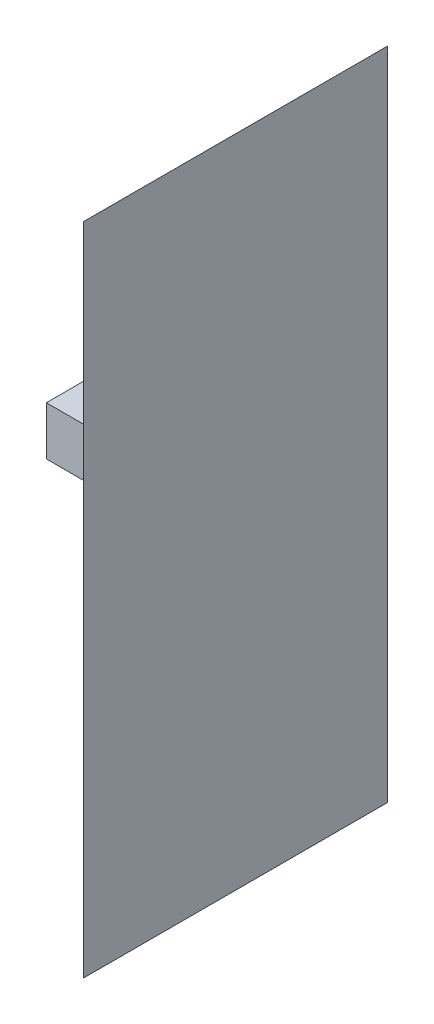
ISO-10303-21;
HEADER;
FILE_DESCRIPTION(('STEP AP214'),'2;1');
FILE_NAME('part.step','',(''),(''),'','','');
FILE_SCHEMA(('AUTOMOTIVE_DESIGN { 1 0 10303 214 1 1 1 1 }'));
ENDSEC;
DATA;
#1=APPLICATION_CONTEXT('core data for automotive mechanical design processes');
#2=APPLICATION_PROTOCOL_DEFINITION('international standard','automotive_design',2000,#1);
#3=PRODUCT_CONTEXT('',#1,'mechanical');
#4=PRODUCT('Part','Part','',(#3));
#5=PRODUCT_RELATED_PRODUCT_CATEGORY('part','',(#4));
#6=PRODUCT_DEFINITION_FORMATION('','',#4);
#7=PRODUCT_DEFINITION_CONTEXT('part definition',#1,'design');
#8=PRODUCT_DEFINITION('design','',#6,#7);
#9=PRODUCT_DEFINITION_SHAPE('','',#8);
#10=(LENGTH_UNIT() NAMED_UNIT(*) SI_UNIT(.MILLI.,.METRE.));
#11=(NAMED_UNIT(*) PLANE_ANGLE_UNIT() SI_UNIT($,.RADIAN.));
#12=(NAMED_UNIT(*) SI_UNIT($,.STERADIAN.) SOLID_ANGLE_UNIT());
#13=UNCERTAINTY_MEASURE_WITH_UNIT(LENGTH_MEASURE(1.E-05),#10,'distance_accuracy_value','');
#14=(GEOMETRIC_REPRESENTATION_CONTEXT(3) GLOBAL_UNCERTAINTY_ASSIGNED_CONTEXT((#13)) GLOBAL_UNIT_ASSIGNED_CONTEXT((#10,
#11,#12)) REPRESENTATION_CONTEXT('',''));
#15=CARTESIAN_POINT('',(0.,0.,0.));
#16=DIRECTION('',(0.,0.,1.));
#17=DIRECTION('',(1.,0.,0.));
#18=AXIS2_PLACEMENT_3D('',#15,#16,#17);
#19=CARTESIAN_POINT('',(47.7266,0.,0.));
#20=DIRECTION('',(1.,0.,0.));
#21=DIRECTION('',(0.,0.,-1.));
#22=AXIS2_PLACEMENT_3D('',#19,#20,#21);
#23=PLANE('',#22);
#24=DIRECTION('',(0.,-1.,0.));
#25=VECTOR('',#24,1.);
#26=CARTESIAN_POINT('',(47.7266,-94.7940905122506,43.9940905122497));
#27=LINE('',#26,#25);
#28=CARTESIAN_POINT('',(47.7266,94.7940905122506,43.9940905122497));
#29=VERTEX_POINT('',#28);
#30=CARTESIAN_POINT('',(47.7266,-94.7940905122506,43.9940905122497));
#31=VERTEX_POINT('',#30);
#32=EDGE_CURVE('E125',#29,#31,#27,.T.);
#33=ORIENTED_EDGE('',*,*,#32,.T.);
#34=DIRECTION('',(0.,0.,-1.));
#35=VECTOR('',#34,1.);
#36=CARTESIAN_POINT('',(47.7266,-94.7940905122506,-43.9940905122497));
#37=LINE('',#36,#35);
#38=CARTESIAN_POINT('',(47.7266,-94.7940905122506,-43.9940905122497));
#39=VERTEX_POINT('',#38);
#40=EDGE_CURVE('E109',#31,#39,#37,.T.);
#41=ORIENTED_EDGE('',*,*,#40,.T.);
#42=DIRECTION('',(0.,1.,0.));
#43=VECTOR('',#42,1.);
#44=CARTESIAN_POINT('',(47.7266,-94.7940905122506,-43.9940905122497));
#45=LINE('',#44,#43);
#46=CARTESIAN_POINT('',(47.7266,94.7940905122506,-43.9940905122497));
#47=VERTEX_POINT('',#46);
#48=EDGE_CURVE('E103',#39,#47,#45,.T.);
#49=ORIENTED_EDGE('',*,*,#48,.T.);
#50=DIRECTION('',(0.,0.,1.));
#51=VECTOR('',#50,1.);
#52=CARTESIAN_POINT('',(47.7266,94.7940905122506,-43.9940905122497));
#53=LINE('',#52,#51);
#54=EDGE_CURVE('E107',#47,#29,#53,.T.);
#55=ORIENTED_EDGE('',*,*,#54,.T.);
#56=EDGE_LOOP('',(#33,#41,#49,#55));
#57=FACE_BOUND('',#56,.T.);
#58=ADVANCED_FACE('F67',(#57),#23,.T.);
#59=CARTESIAN_POINT('',(16.74495,0.,-9.6677013900668));
#60=DIRECTION('',(0.86602540378444,0.,-0.499999999999998));
#61=DIRECTION('',(-0.499999999999998,0.,-0.86602540378444));
#62=AXIS2_PLACEMENT_3D('',#59,#60,#61);
#63=PLANE('',#62);
#64=DIRECTION('',(-0.236173745241571,-0.88141241665538,-0.409064926172231));
#65=VECTOR('',#64,1.);
#66=CARTESIAN_POINT('',(47.7266,94.7940905122506,43.9940905122497));
#67=LINE('',#66,#65);
#68=CARTESIAN_POINT('',(22.3266,0.,0.));
#69=VERTEX_POINT('',#68);
#70=EDGE_CURVE('E123',#29,#69,#67,.T.);
#71=ORIENTED_EDGE('',*,*,#70,.T.);
#72=DIRECTION('',(-0.236173745241571,0.88141241665538,-0.409064926172231));
#73=VECTOR('',#72,1.);
#74=CARTESIAN_POINT('',(47.7266,-94.7940905122506,43.9940905122497));
#75=LINE('',#74,#73);
#76=EDGE_CURVE('E88',#31,#69,#75,.T.);
#77=ORIENTED_EDGE('',*,*,#76,.F.);
#78=ORIENTED_EDGE('',*,*,#32,.F.);
#79=EDGE_LOOP('',(#71,#77,#78));
#80=FACE_BOUND('',#79,.T.);
#81=ADVANCED_FACE('F168',(#80),#63,.F.);
#82=CARTESIAN_POINT('',(20.8310013900669,5.58164999999995,0.));
#83=DIRECTION('',(-0.965925826289069,-0.258819045102518,0.));
#84=DIRECTION('',(0.258819045102518,-0.965925826289069,0.));
#85=AXIS2_PLACEMENT_3D('',#82,#83,#84);
#86=PLANE('',#85);
#87=ORIENTED_EDGE('',*,*,#76,.T.);
#88=DIRECTION('',(-0.236173745241571,0.88141241665538,0.409064926172231));
#89=VECTOR('',#88,1.);
#90=CARTESIAN_POINT('',(47.7266,-94.7940905122506,-43.9940905122497));
#91=LINE('',#90,#89);
#92=EDGE_CURVE('E13',#39,#69,#91,.T.);
#93=ORIENTED_EDGE('',*,*,#92,.F.);
#94=ORIENTED_EDGE('',*,*,#40,.F.);
#95=EDGE_LOOP('',(#87,#93,#94));
#96=FACE_BOUND('',#95,.T.);
#97=ADVANCED_FACE('F182',(#96),#86,.T.);
#98=CARTESIAN_POINT('',(20.8310013900669,-5.58164999999995,0.));
#99=DIRECTION('',(-0.965925826289069,0.258819045102518,0.));
#100=DIRECTION('',(-0.258819045102518,-0.965925826289069,0.));
#101=AXIS2_PLACEMENT_3D('',#98,#99,#100);
#102=PLANE('',#101);
#103=DIRECTION('',(-0.236173745241571,-0.88141241665538,0.409064926172231));
#104=VECTOR('',#103,1.);
#105=CARTESIAN_POINT('',(47.7266,94.7940905122506,-43.9940905122497));
#106=LINE('',#105,#104);
#107=EDGE_CURVE('E80',#47,#69,#106,.T.);
#108=ORIENTED_EDGE('',*,*,#107,.T.);
#109=ORIENTED_EDGE('',*,*,#70,.F.);
#110=ORIENTED_EDGE('',*,*,#54,.F.);
#111=EDGE_LOOP('',(#108,#109,#110));
#112=FACE_BOUND('',#111,.T.);
#113=ADVANCED_FACE('F122',(#112),#102,.T.);
#114=CARTESIAN_POINT('',(16.74495,0.,9.66770139006679));
#115=DIRECTION('',(0.86602540378444,0.,0.499999999999998));
#116=DIRECTION('',(0.499999999999998,0.,-0.86602540378444));
#117=AXIS2_PLACEMENT_3D('',#114,#115,#116);
#118=PLANE('',#117);
#119=ORIENTED_EDGE('',*,*,#92,.T.);
#120=ORIENTED_EDGE('',*,*,#107,.F.);
#121=ORIENTED_EDGE('',*,*,#48,.F.);
#122=EDGE_LOOP('',(#119,#120,#121));
#123=FACE_BOUND('',#122,.T.);
#124=ADVANCED_FACE('F69',(#123),#118,.F.);
#125=CLOSED_SHELL('',(#58,#81,#97,#113,#124));
#126=MANIFOLD_SOLID_BREP('B2',#125);
#127=CARTESIAN_POINT('',(0.,0.,0.));
#128=DIRECTION('',(1.,0.,0.));
#129=DIRECTION('',(0.,0.,-1.));
#130=AXIS2_PLACEMENT_3D('',#127,#128,#129);
#131=PLANE('',#130);
#132=DIRECTION('',(0.,-1.,0.));
#133=VECTOR('',#132,1.);
#134=CARTESIAN_POINT('',(0.,-7.0485,-4.5085));
#135=LINE('',#134,#133);
#136=CARTESIAN_POINT('',(0.,3.2893,-4.5085));
#137=VERTEX_POINT('',#136);
#138=CARTESIAN_POINT('',(0.,-7.0485,-4.5085));
#139=VERTEX_POINT('',#138);
#140=EDGE_CURVE('E279',#137,#139,#135,.T.);
#141=ORIENTED_EDGE('',*,*,#140,.F.);
#142=DIRECTION('',(0.,0.,-1.));
#143=VECTOR('',#142,1.);
#144=CARTESIAN_POINT('',(0.,3.2893,-1.0795));
#145=LINE('',#144,#143);
#146=CARTESIAN_POINT('',(0.,3.2893,-1.0795));
#147=VERTEX_POINT('',#146);
#148=EDGE_CURVE('E524',#147,#137,#145,.T.);
#149=ORIENTED_EDGE('',*,*,#148,.F.);
#150=DIRECTION('',(0.,1.,0.));
#151=VECTOR('',#150,1.);
#152=CARTESIAN_POINT('',(0.,-7.0485,-1.0795));
#153=LINE('',#152,#151);
#154=CARTESIAN_POINT('',(0.,-7.0485,-1.0795));
#155=VERTEX_POINT('',#154);
#156=EDGE_CURVE('E526',#155,#147,#153,.T.);
#157=ORIENTED_EDGE('',*,*,#156,.F.);
#158=DIRECTION('',(0.,0.,-1.));
#159=VECTOR('',#158,1.);
#160=CARTESIAN_POINT('',(0.,-7.0485,-7.0485));
#161=LINE('',#160,#159);
#162=CARTESIAN_POINT('',(0.,-7.0485,7.0485));
#163=VERTEX_POINT('',#162);
#164=EDGE_CURVE('E351',#163,#155,#161,.T.);
#165=ORIENTED_EDGE('',*,*,#164,.F.);
#166=DIRECTION('',(0.,-1.,0.));
#167=VECTOR('',#166,1.);
#168=CARTESIAN_POINT('',(0.,7.0485,7.0485));
#169=LINE('',#168,#167);
#170=CARTESIAN_POINT('',(0.,7.0485,7.0485));
#171=VERTEX_POINT('',#170);
#172=EDGE_CURVE('E370',#171,#163,#169,.T.);
#173=ORIENTED_EDGE('',*,*,#172,.F.);
#174=DIRECTION('',(0.,0.,1.));
#175=VECTOR('',#174,1.);
#176=CARTESIAN_POINT('',(0.,7.0485,-7.0485));
#177=LINE('',#176,#175);
#178=CARTESIAN_POINT('',(0.,7.0485,-7.0485));
#179=VERTEX_POINT('',#178);
#180=EDGE_CURVE('E380',#179,#171,#177,.T.);
#181=ORIENTED_EDGE('',*,*,#180,.F.);
#182=DIRECTION('',(0.,1.,0.));
#183=VECTOR('',#182,1.);
#184=CARTESIAN_POINT('',(0.,7.0485,-7.0485));
#185=LINE('',#184,#183);
#186=CARTESIAN_POINT('',(0.,-7.0485,-7.0485));
#187=VERTEX_POINT('',#186);
#188=EDGE_CURVE('E378',#187,#179,#185,.T.);
#189=ORIENTED_EDGE('',*,*,#188,.F.);
#190=EDGE_CURVE('E284',#139,#187,#161,.T.);
#191=ORIENTED_EDGE('',*,*,#190,.F.);
#192=EDGE_LOOP('',(#141,#149,#157,#165,#173,#181,#189,#191));
#193=FACE_BOUND('',#192,.T.);
#194=ADVANCED_FACE('F263',(#193),#131,.F.);
#195=CARTESIAN_POINT('',(12.446,-7.0485,-7.0485));
#196=DIRECTION('',(0.,1.,0.));
#197=DIRECTION('',(0.,0.,1.));
#198=AXIS2_PLACEMENT_3D('',#195,#196,#197);
#199=PLANE('',#198);
#200=CARTESIAN_POINT('',(8.255,-7.0485,0.));
#201=DIRECTION('',(0.,1.,0.));
#202=DIRECTION('',(0.,0.,1.));
#203=AXIS2_PLACEMENT_3D('',#200,#201,#202);
#204=CIRCLE('',#203,1.);
#205=CARTESIAN_POINT('',(8.255,-7.0485,1.));
#206=VERTEX_POINT('',#205);
#207=EDGE_CURVE('E355',#206,#206,#204,.T.);
#208=ORIENTED_EDGE('',*,*,#207,.T.);
#209=EDGE_LOOP('',(#208));
#210=FACE_BOUND('',#209,.T.);
#211=ORIENTED_EDGE('',*,*,#164,.T.);
#212=DIRECTION('',(1.,0.,0.));
#213=VECTOR('',#212,1.);
#214=CARTESIAN_POINT('',(-3.429,-7.0485,-1.0795));
#215=LINE('',#214,#213);
#216=CARTESIAN_POINT('',(-3.429,-7.0485,-1.0795));
#217=VERTEX_POINT('',#216);
#218=EDGE_CURVE('E332',#217,#155,#215,.T.);
#219=ORIENTED_EDGE('',*,*,#218,.F.);
#220=DIRECTION('',(0.,0.,1.));
#221=VECTOR('',#220,1.);
#222=CARTESIAN_POINT('',(-3.429,-7.0485,-1.0795));
#223=LINE('',#222,#221);
#224=CARTESIAN_POINT('',(-3.429,-7.0485,-4.5085));
#225=VERTEX_POINT('',#224);
#226=EDGE_CURVE('E338',#225,#217,#223,.T.);
#227=ORIENTED_EDGE('',*,*,#226,.F.);
#228=DIRECTION('',(1.,0.,0.));
#229=VECTOR('',#228,1.);
#230=CARTESIAN_POINT('',(-3.429,-7.0485,-4.5085));
#231=LINE('',#230,#229);
#232=EDGE_CURVE('E397',#225,#139,#231,.T.);
#233=ORIENTED_EDGE('',*,*,#232,.T.);
#234=ORIENTED_EDGE('',*,*,#190,.T.);
#235=DIRECTION('',(-1.,0.,0.));
#236=VECTOR('',#235,1.);
#237=CARTESIAN_POINT('',(12.446,-7.0485,-7.0485));
#238=LINE('',#237,#236);
#239=CARTESIAN_POINT('',(12.446,-7.0485,-7.0485));
#240=VERTEX_POINT('',#239);
#241=EDGE_CURVE('E267',#240,#187,#238,.T.);
#242=ORIENTED_EDGE('',*,*,#241,.F.);
#243=DIRECTION('',(0.,0.,-1.));
#244=VECTOR('',#243,1.);
#245=CARTESIAN_POINT('',(12.446,-7.0485,-7.0485));
#246=LINE('',#245,#244);
#247=CARTESIAN_POINT('',(12.446,-7.0485,7.0485));
#248=VERTEX_POINT('',#247);
#249=EDGE_CURVE('E366',#248,#240,#246,.T.);
#250=ORIENTED_EDGE('',*,*,#249,.F.);
#251=DIRECTION('',(-1.,0.,0.));
#252=VECTOR('',#251,1.);
#253=CARTESIAN_POINT('',(12.446,-7.0485,7.0485));
#254=LINE('',#253,#252);
#255=EDGE_CURVE('E376',#248,#163,#254,.T.);
#256=ORIENTED_EDGE('',*,*,#255,.T.);
#257=EDGE_LOOP('',(#211,#219,#227,#233,#234,#242,#250,#256));
#258=FACE_BOUND('',#257,.T.);
#259=ADVANCED_FACE('F265',(#210,#258),#199,.F.);
#260=CARTESIAN_POINT('',(12.446,7.0485,-7.0485));
#261=DIRECTION('',(0.,0.,1.));
#262=DIRECTION('',(0.,-1.,0.));
#263=AXIS2_PLACEMENT_3D('',#260,#261,#262);
#264=PLANE('',#263);
#265=ORIENTED_EDGE('',*,*,#188,.T.);
#266=DIRECTION('',(-1.,0.,0.));
#267=VECTOR('',#266,1.);
#268=CARTESIAN_POINT('',(12.446,7.0485,-7.0485));
#269=LINE('',#268,#267);
#270=CARTESIAN_POINT('',(12.446,7.0485,-7.0485));
#271=VERTEX_POINT('',#270);
#272=EDGE_CURVE('E386',#271,#179,#269,.T.);
#273=ORIENTED_EDGE('',*,*,#272,.F.);
#274=DIRECTION('',(0.,1.,0.));
#275=VECTOR('',#274,1.);
#276=CARTESIAN_POINT('',(12.446,7.0485,-7.0485));
#277=LINE('',#276,#275);
#278=EDGE_CURVE('E369',#240,#271,#277,.T.);
#279=ORIENTED_EDGE('',*,*,#278,.F.);
#280=ORIENTED_EDGE('',*,*,#241,.T.);
#281=EDGE_LOOP('',(#265,#273,#279,#280));
#282=FACE_BOUND('',#281,.T.);
#283=ADVANCED_FACE('F395',(#282),#264,.F.);
#284=CARTESIAN_POINT('',(12.446,7.0485,-7.0485));
#285=DIRECTION('',(0.,-1.,0.));
#286=DIRECTION('',(0.,0.,-1.));
#287=AXIS2_PLACEMENT_3D('',#284,#285,#286);
#288=PLANE('',#287);
#289=CARTESIAN_POINT('',(8.255,7.0485,0.));
#290=DIRECTION('',(0.,1.,0.));
#291=DIRECTION('',(0.,0.,1.));
#292=AXIS2_PLACEMENT_3D('',#289,#290,#291);
#293=CIRCLE('',#292,1.);
#294=CARTESIAN_POINT('',(8.255,7.0485,1.));
#295=VERTEX_POINT('',#294);
#296=EDGE_CURVE('E352',#295,#295,#293,.T.);
#297=ORIENTED_EDGE('',*,*,#296,.F.);
#298=EDGE_LOOP('',(#297));
#299=FACE_BOUND('',#298,.T.);
#300=ORIENTED_EDGE('',*,*,#180,.T.);
#301=DIRECTION('',(-1.,0.,0.));
#302=VECTOR('',#301,1.);
#303=CARTESIAN_POINT('',(12.446,7.0485,7.0485));
#304=LINE('',#303,#302);
#305=CARTESIAN_POINT('',(12.446,7.0485,7.0485));
#306=VERTEX_POINT('',#305);
#307=EDGE_CURVE('E384',#306,#171,#304,.T.);
#308=ORIENTED_EDGE('',*,*,#307,.F.);
#309=DIRECTION('',(0.,0.,1.));
#310=VECTOR('',#309,1.);
#311=CARTESIAN_POINT('',(12.446,7.0485,-7.0485));
#312=LINE('',#311,#310);
#313=EDGE_CURVE('E372',#271,#306,#312,.T.);
#314=ORIENTED_EDGE('',*,*,#313,.F.);
#315=ORIENTED_EDGE('',*,*,#272,.T.);
#316=EDGE_LOOP('',(#300,#308,#314,#315));
#317=FACE_BOUND('',#316,.T.);
#318=ADVANCED_FACE('F400',(#299,#317),#288,.F.);
#319=CARTESIAN_POINT('',(12.446,7.0485,7.0485));
#320=DIRECTION('',(0.,0.,-1.));
#321=DIRECTION('',(0.,1.,0.));
#322=AXIS2_PLACEMENT_3D('',#319,#320,#321);
#323=PLANE('',#322);
#324=ORIENTED_EDGE('',*,*,#172,.T.);
#325=ORIENTED_EDGE('',*,*,#255,.F.);
#326=DIRECTION('',(0.,-1.,0.));
#327=VECTOR('',#326,1.);
#328=CARTESIAN_POINT('',(12.446,7.0485,7.0485));
#329=LINE('',#328,#327);
#330=EDGE_CURVE('E374',#306,#248,#329,.T.);
#331=ORIENTED_EDGE('',*,*,#330,.F.);
#332=ORIENTED_EDGE('',*,*,#307,.T.);
#333=EDGE_LOOP('',(#324,#325,#331,#332));
#334=FACE_BOUND('',#333,.T.);
#335=ADVANCED_FACE('F403',(#334),#323,.F.);
#336=CARTESIAN_POINT('',(12.446,0.,0.));
#337=DIRECTION('',(1.,0.,0.));
#338=DIRECTION('',(0.,0.,-1.));
#339=AXIS2_PLACEMENT_3D('',#336,#337,#338);
#340=PLANE('',#339);
#341=CARTESIAN_POINT('',(12.446,0.,0.));
#342=DIRECTION('',(1.,0.,0.));
#343=DIRECTION('',(0.,0.,-1.));
#344=AXIS2_PLACEMENT_3D('',#341,#342,#343);
#345=CIRCLE('',#344,5.08);
#346=CARTESIAN_POINT('',(12.446,0.,-5.08));
#347=VERTEX_POINT('',#346);
#348=EDGE_CURVE('E65',#347,#347,#345,.T.);
#349=ORIENTED_EDGE('',*,*,#348,.F.);
#350=EDGE_LOOP('',(#349));
#351=FACE_BOUND('',#350,.T.);
#352=ORIENTED_EDGE('',*,*,#249,.T.);
#353=ORIENTED_EDGE('',*,*,#278,.T.);
#354=ORIENTED_EDGE('',*,*,#313,.T.);
#355=ORIENTED_EDGE('',*,*,#330,.T.);
#356=EDGE_LOOP('',(#352,#353,#354,#355));
#357=FACE_BOUND('',#356,.T.);
#358=ADVANCED_FACE('F406',(#351,#357),#340,.T.);
#359=CARTESIAN_POINT('',(22.3266,0.,0.));
#360=DIRECTION('',(-1.,0.,0.));
#361=DIRECTION('',(0.,0.,1.));
#362=AXIS2_PLACEMENT_3D('',#359,#360,#361);
#363=CYLINDRICAL_SURFACE('',#362,5.08);
#364=CARTESIAN_POINT('',(22.3266,0.,0.));
#365=DIRECTION('',(1.,0.,0.));
#366=DIRECTION('',(0.,0.,-1.));
#367=AXIS2_PLACEMENT_3D('',#364,#365,#366);
#368=CIRCLE('',#367,5.08);
#369=CARTESIAN_POINT('',(22.3266,0.,-5.08));
#370=VERTEX_POINT('',#369);
#371=EDGE_CURVE('E363',#370,#370,#368,.T.);
#372=ORIENTED_EDGE('',*,*,#371,.F.);
#373=EDGE_LOOP('',(#372));
#374=FACE_BOUND('',#373,.T.);
#375=ORIENTED_EDGE('',*,*,#348,.T.);
#376=EDGE_LOOP('',(#375));
#377=FACE_BOUND('',#376,.T.);
#378=ADVANCED_FACE('F408',(#374,#377),#363,.T.);
#379=CARTESIAN_POINT('',(22.3266,0.,0.));
#380=DIRECTION('',(1.,0.,0.));
#381=DIRECTION('',(0.,0.,-1.));
#382=AXIS2_PLACEMENT_3D('',#379,#380,#381);
#383=PLANE('',#382);
#384=ORIENTED_EDGE('',*,*,#371,.T.);
#385=EDGE_LOOP('',(#384));
#386=FACE_BOUND('',#385,.T.);
#387=ADVANCED_FACE('F415',(#386),#383,.T.);
#388=CARTESIAN_POINT('',(8.255,-7.0485,0.));
#389=DIRECTION('',(0.,1.,0.));
#390=DIRECTION('',(0.,0.,1.));
#391=AXIS2_PLACEMENT_3D('',#388,#389,#390);
#392=CYLINDRICAL_SURFACE('',#391,1.);
#393=ORIENTED_EDGE('',*,*,#207,.F.);
#394=EDGE_LOOP('',(#393));
#395=FACE_BOUND('',#394,.T.);
#396=ORIENTED_EDGE('',*,*,#296,.T.);
#397=EDGE_LOOP('',(#396));
#398=FACE_BOUND('',#397,.T.);
#399=ADVANCED_FACE('F463',(#395,#398),#392,.F.);
#400=CARTESIAN_POINT('',(-3.429,-7.0485,-1.0795));
#401=DIRECTION('',(0.,0.,-1.));
#402=DIRECTION('',(0.,1.,0.));
#403=AXIS2_PLACEMENT_3D('',#400,#401,#402);
#404=PLANE('',#403);
#405=ORIENTED_EDGE('',*,*,#156,.T.);
#406=DIRECTION('',(1.,0.,0.));
#407=VECTOR('',#406,1.);
#408=CARTESIAN_POINT('',(-3.429,3.2893,-1.0795));
#409=LINE('',#408,#407);
#410=CARTESIAN_POINT('',(-3.429,3.2893,-1.0795));
#411=VERTEX_POINT('',#410);
#412=EDGE_CURVE('E334',#411,#147,#409,.T.);
#413=ORIENTED_EDGE('',*,*,#412,.F.);
#414=DIRECTION('',(0.,1.,0.));
#415=VECTOR('',#414,1.);
#416=CARTESIAN_POINT('',(-3.429,-7.0485,-1.0795));
#417=LINE('',#416,#415);
#418=EDGE_CURVE('E327',#217,#411,#417,.T.);
#419=ORIENTED_EDGE('',*,*,#418,.F.);
#420=ORIENTED_EDGE('',*,*,#218,.T.);
#421=EDGE_LOOP('',(#405,#413,#419,#420));
#422=FACE_BOUND('',#421,.T.);
#423=ADVANCED_FACE('F330',(#422),#404,.F.);
#424=CARTESIAN_POINT('',(-3.429,3.2893,-1.0795));
#425=DIRECTION('',(0.,-1.,0.));
#426=DIRECTION('',(0.,0.,-1.));
#427=AXIS2_PLACEMENT_3D('',#424,#425,#426);
#428=PLANE('',#427);
#429=ORIENTED_EDGE('',*,*,#148,.T.);
#430=DIRECTION('',(1.,0.,0.));
#431=VECTOR('',#430,1.);
#432=CARTESIAN_POINT('',(-3.429,3.2893,-4.5085));
#433=LINE('',#432,#431);
#434=CARTESIAN_POINT('',(-3.429,3.2893,-4.5085));
#435=VERTEX_POINT('',#434);
#436=EDGE_CURVE('E357',#435,#137,#433,.T.);
#437=ORIENTED_EDGE('',*,*,#436,.F.);
#438=DIRECTION('',(0.,0.,-1.));
#439=VECTOR('',#438,1.);
#440=CARTESIAN_POINT('',(-3.429,3.2893,-1.0795));
#441=LINE('',#440,#439);
#442=EDGE_CURVE('E337',#411,#435,#441,.T.);
#443=ORIENTED_EDGE('',*,*,#442,.F.);
#444=ORIENTED_EDGE('',*,*,#412,.T.);
#445=EDGE_LOOP('',(#429,#437,#443,#444));
#446=FACE_BOUND('',#445,.T.);
#447=ADVANCED_FACE('F492',(#446),#428,.F.);
#448=CARTESIAN_POINT('',(-3.429,-7.0485,-4.5085));
#449=DIRECTION('',(0.,0.,1.));
#450=DIRECTION('',(0.,-1.,0.));
#451=AXIS2_PLACEMENT_3D('',#448,#449,#450);
#452=PLANE('',#451);
#453=ORIENTED_EDGE('',*,*,#140,.T.);
#454=ORIENTED_EDGE('',*,*,#232,.F.);
#455=DIRECTION('',(0.,-1.,0.));
#456=VECTOR('',#455,1.);
#457=CARTESIAN_POINT('',(-3.429,-7.0485,-4.5085));
#458=LINE('',#457,#456);
#459=EDGE_CURVE('E343',#435,#225,#458,.T.);
#460=ORIENTED_EDGE('',*,*,#459,.F.);
#461=ORIENTED_EDGE('',*,*,#436,.T.);
#462=EDGE_LOOP('',(#453,#454,#460,#461));
#463=FACE_BOUND('',#462,.T.);
#464=ADVANCED_FACE('F501',(#463),#452,.F.);
#465=CARTESIAN_POINT('',(-3.429,0.,0.));
#466=DIRECTION('',(1.,0.,0.));
#467=DIRECTION('',(0.,0.,-1.));
#468=AXIS2_PLACEMENT_3D('',#465,#466,#467);
#469=PLANE('',#468);
#470=ORIENTED_EDGE('',*,*,#226,.T.);
#471=ORIENTED_EDGE('',*,*,#418,.T.);
#472=ORIENTED_EDGE('',*,*,#442,.T.);
#473=ORIENTED_EDGE('',*,*,#459,.T.);
#474=EDGE_LOOP('',(#470,#471,#472,#473));
#475=FACE_BOUND('',#474,.T.);
#476=ADVANCED_FACE('F341',(#475),#469,.F.);
#477=CLOSED_SHELL('',(#194,#259,#283,#318,#335,#358,#378,#387,#399,#423,#447,#464,#476));
#478=MANIFOLD_SOLID_BREP('B7',#477);
#479=ADVANCED_BREP_SHAPE_REPRESENTATION('',(#18,#126,#478),#14);
#480=SHAPE_DEFINITION_REPRESENTATION(#9,#479);
ENDSEC;
END-ISO-10303-21;
